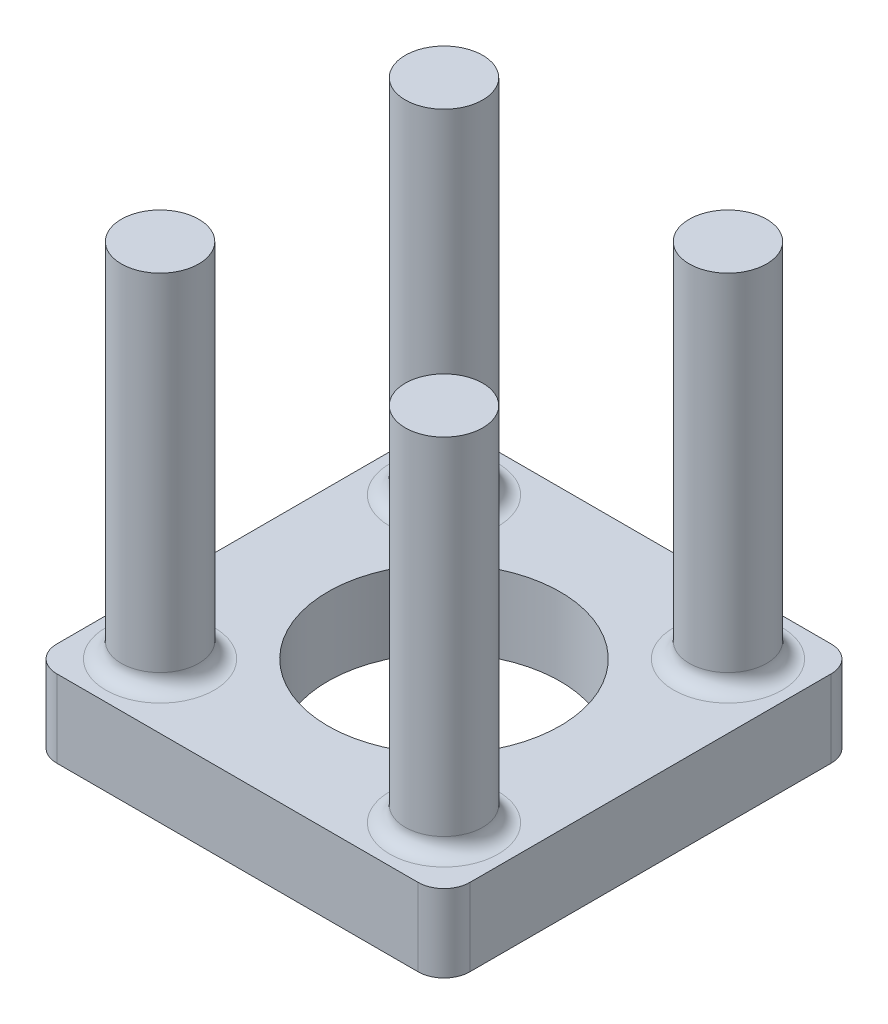
ISO-10303-21;
HEADER;
FILE_DESCRIPTION(('STEP AP214'),'2;1');
FILE_NAME('part.step','',(''),(''),'','','');
FILE_SCHEMA(('AUTOMOTIVE_DESIGN { 1 0 10303 214 1 1 1 1 }'));
ENDSEC;
DATA;
#1=APPLICATION_CONTEXT('core data for automotive mechanical design processes');
#2=APPLICATION_PROTOCOL_DEFINITION('international standard','automotive_design',2000,#1);
#3=PRODUCT_CONTEXT('',#1,'mechanical');
#4=PRODUCT('Part','Part','',(#3));
#5=PRODUCT_RELATED_PRODUCT_CATEGORY('part','',(#4));
#6=PRODUCT_DEFINITION_FORMATION('','',#4);
#7=PRODUCT_DEFINITION_CONTEXT('part definition',#1,'design');
#8=PRODUCT_DEFINITION('design','',#6,#7);
#9=PRODUCT_DEFINITION_SHAPE('','',#8);
#10=(LENGTH_UNIT() NAMED_UNIT(*) SI_UNIT(.MILLI.,.METRE.));
#11=(NAMED_UNIT(*) PLANE_ANGLE_UNIT() SI_UNIT($,.RADIAN.));
#12=(NAMED_UNIT(*) SI_UNIT($,.STERADIAN.) SOLID_ANGLE_UNIT());
#13=UNCERTAINTY_MEASURE_WITH_UNIT(LENGTH_MEASURE(1.E-05),#10,'distance_accuracy_value','');
#14=(GEOMETRIC_REPRESENTATION_CONTEXT(3) GLOBAL_UNCERTAINTY_ASSIGNED_CONTEXT((#13)) GLOBAL_UNIT_ASSIGNED_CONTEXT((#10,
#11,#12)) REPRESENTATION_CONTEXT('',''));
#15=CARTESIAN_POINT('',(0.,0.,0.));
#16=DIRECTION('',(0.,0.,1.));
#17=DIRECTION('',(1.,0.,0.));
#18=AXIS2_PLACEMENT_3D('',#15,#16,#17);
#19=CARTESIAN_POINT('',(0.,15.,0.));
#20=DIRECTION('',(0.,1.,0.));
#21=DIRECTION('',(0.,0.,1.));
#22=AXIS2_PLACEMENT_3D('',#19,#20,#21);
#23=PLANE('',#22);
#24=CARTESIAN_POINT('',(38.5243902439025,15.,48.9512195121952));
#25=DIRECTION('',(0.,1.,0.));
#26=DIRECTION('',(0.,0.,1.));
#27=AXIS2_PLACEMENT_3D('',#24,#25,#26);
#28=CIRCLE('',#27,10.5);
#29=CARTESIAN_POINT('',(38.5243902439025,15.,59.4512195121951));
#30=VERTEX_POINT('',#29);
#31=EDGE_CURVE('E211',#30,#30,#28,.F.);
#32=ORIENTED_EDGE('',*,*,#31,.T.);
#33=EDGE_LOOP('',(#32));
#34=FACE_BOUND('',#33,.T.);
#35=CARTESIAN_POINT('',(38.5243902439025,15.,-6.04878048780485));
#36=DIRECTION('',(0.,1.,0.));
#37=DIRECTION('',(0.,0.,1.));
#38=AXIS2_PLACEMENT_3D('',#35,#36,#37);
#39=CIRCLE('',#38,10.5);
#40=CARTESIAN_POINT('',(38.5243902439025,15.,4.45121951219515));
#41=VERTEX_POINT('',#40);
#42=EDGE_CURVE('E207',#41,#41,#39,.F.);
#43=ORIENTED_EDGE('',*,*,#42,.T.);
#44=EDGE_LOOP('',(#43));
#45=FACE_BOUND('',#44,.T.);
#46=CARTESIAN_POINT('',(-16.4756097560975,15.,-6.04878048780485));
#47=DIRECTION('',(0.,1.,0.));
#48=DIRECTION('',(0.,0.,1.));
#49=AXIS2_PLACEMENT_3D('',#46,#47,#48);
#50=CIRCLE('',#49,10.5);
#51=CARTESIAN_POINT('',(-16.4756097560975,15.,4.45121951219515));
#52=VERTEX_POINT('',#51);
#53=EDGE_CURVE('E203',#52,#52,#50,.F.);
#54=ORIENTED_EDGE('',*,*,#53,.T.);
#55=EDGE_LOOP('',(#54));
#56=FACE_BOUND('',#55,.T.);
#57=CARTESIAN_POINT('',(-16.4756097560975,15.,48.9512195121952));
#58=DIRECTION('',(0.,1.,0.));
#59=DIRECTION('',(0.,0.,1.));
#60=AXIS2_PLACEMENT_3D('',#57,#58,#59);
#61=CIRCLE('',#60,10.5);
#62=CARTESIAN_POINT('',(-16.4756097560975,15.,59.4512195121951));
#63=VERTEX_POINT('',#62);
#64=EDGE_CURVE('E199',#63,#63,#61,.F.);
#65=ORIENTED_EDGE('',*,*,#64,.T.);
#66=EDGE_LOOP('',(#65));
#67=FACE_BOUND('',#66,.T.);
#68=DIRECTION('',(-1.,0.,0.));
#69=VECTOR('',#68,1.);
#70=CARTESIAN_POINT('',(-28.9756097560975,15.,-18.5487804878048));
#71=LINE('',#70,#69);
#72=CARTESIAN_POINT('',(46.0243902439025,15.,-18.5487804878048));
#73=VERTEX_POINT('',#72);
#74=CARTESIAN_POINT('',(-23.9756097560975,15.,-18.5487804878048));
#75=VERTEX_POINT('',#74);
#76=EDGE_CURVE('E149',#73,#75,#71,.T.);
#77=ORIENTED_EDGE('',*,*,#76,.T.);
#78=CARTESIAN_POINT('',(-23.9756097560975,15.,-13.5487804878048));
#79=DIRECTION('',(0.,1.,0.));
#80=DIRECTION('',(0.,0.,1.));
#81=AXIS2_PLACEMENT_3D('',#78,#79,#80);
#82=CIRCLE('',#81,5.);
#83=CARTESIAN_POINT('',(-28.9756097560975,15.,-13.5487804878048));
#84=VERTEX_POINT('',#83);
#85=EDGE_CURVE('E179',#75,#84,#82,.T.);
#86=ORIENTED_EDGE('',*,*,#85,.T.);
#87=DIRECTION('',(0.,0.,1.));
#88=VECTOR('',#87,1.);
#89=CARTESIAN_POINT('',(-28.9756097560975,15.,-18.5487804878048));
#90=LINE('',#89,#88);
#91=CARTESIAN_POINT('',(-28.9756097560975,15.,56.4512195121951));
#92=VERTEX_POINT('',#91);
#93=EDGE_CURVE('E128',#84,#92,#90,.T.);
#94=ORIENTED_EDGE('',*,*,#93,.T.);
#95=CARTESIAN_POINT('',(-23.9756097560975,15.,56.4512195121952));
#96=DIRECTION('',(0.,1.,0.));
#97=DIRECTION('',(0.,0.,1.));
#98=AXIS2_PLACEMENT_3D('',#95,#96,#97);
#99=CIRCLE('',#98,5.);
#100=CARTESIAN_POINT('',(-23.9756097560975,15.,61.4512195121952));
#101=VERTEX_POINT('',#100);
#102=EDGE_CURVE('E176',#92,#101,#99,.T.);
#103=ORIENTED_EDGE('',*,*,#102,.T.);
#104=DIRECTION('',(1.,0.,0.));
#105=VECTOR('',#104,1.);
#106=CARTESIAN_POINT('',(-28.9756097560975,15.,61.4512195121952));
#107=LINE('',#106,#105);
#108=CARTESIAN_POINT('',(46.0243902439025,15.,61.4512195121952));
#109=VERTEX_POINT('',#108);
#110=EDGE_CURVE('E320',#101,#109,#107,.T.);
#111=ORIENTED_EDGE('',*,*,#110,.T.);
#112=CARTESIAN_POINT('',(46.0243902439025,15.,56.4512195121951));
#113=DIRECTION('',(0.,1.,0.));
#114=DIRECTION('',(0.,0.,1.));
#115=AXIS2_PLACEMENT_3D('',#112,#113,#114);
#116=CIRCLE('',#115,5.);
#117=CARTESIAN_POINT('',(51.0243902439025,15.,56.4512195121951));
#118=VERTEX_POINT('',#117);
#119=EDGE_CURVE('E62',#109,#118,#116,.T.);
#120=ORIENTED_EDGE('',*,*,#119,.T.);
#121=DIRECTION('',(0.,0.,-1.));
#122=VECTOR('',#121,1.);
#123=CARTESIAN_POINT('',(51.0243902439025,15.,-18.5487804878048));
#124=LINE('',#123,#122);
#125=CARTESIAN_POINT('',(51.0243902439025,15.,-13.5487804878048));
#126=VERTEX_POINT('',#125);
#127=EDGE_CURVE('E322',#118,#126,#124,.T.);
#128=ORIENTED_EDGE('',*,*,#127,.T.);
#129=CARTESIAN_POINT('',(46.0243902439025,15.,-13.5487804878048));
#130=DIRECTION('',(0.,1.,0.));
#131=DIRECTION('',(0.,0.,1.));
#132=AXIS2_PLACEMENT_3D('',#129,#130,#131);
#133=CIRCLE('',#132,5.);
#134=EDGE_CURVE('E171',#126,#73,#133,.T.);
#135=ORIENTED_EDGE('',*,*,#134,.T.);
#136=EDGE_LOOP('',(#77,#86,#94,#103,#111,#120,#128,#135));
#137=FACE_BOUND('',#136,.T.);
#138=CARTESIAN_POINT('',(11.0243902439025,15.,21.4512195121951));
#139=DIRECTION('',(0.,1.,0.));
#140=DIRECTION('',(0.,0.,1.));
#141=AXIS2_PLACEMENT_3D('',#138,#139,#140);
#142=CIRCLE('',#141,22.5);
#143=CARTESIAN_POINT('',(11.0243902439025,15.,43.9512195121951));
#144=VERTEX_POINT('',#143);
#145=EDGE_CURVE('E138',#144,#144,#142,.T.);
#146=ORIENTED_EDGE('',*,*,#145,.F.);
#147=EDGE_LOOP('',(#146));
#148=FACE_BOUND('',#147,.T.);
#149=ADVANCED_FACE('F39',(#34,#45,#56,#67,#137,#148),#23,.T.);
#150=CARTESIAN_POINT('',(0.,0.,0.));
#151=DIRECTION('',(0.,1.,0.));
#152=DIRECTION('',(0.,0.,1.));
#153=AXIS2_PLACEMENT_3D('',#150,#151,#152);
#154=PLANE('',#153);
#155=DIRECTION('',(0.,0.,1.));
#156=VECTOR('',#155,1.);
#157=CARTESIAN_POINT('',(-28.9756097560975,0.,-18.5487804878048));
#158=LINE('',#157,#156);
#159=CARTESIAN_POINT('',(-28.9756097560975,0.,-13.5487804878048));
#160=VERTEX_POINT('',#159);
#161=CARTESIAN_POINT('',(-28.9756097560975,0.,56.4512195121951));
#162=VERTEX_POINT('',#161);
#163=EDGE_CURVE('E125',#160,#162,#158,.T.);
#164=ORIENTED_EDGE('',*,*,#163,.F.);
#165=CARTESIAN_POINT('',(-23.9756097560975,0.,-13.5487804878048));
#166=DIRECTION('',(0.,1.,0.));
#167=DIRECTION('',(0.,0.,1.));
#168=AXIS2_PLACEMENT_3D('',#165,#166,#167);
#169=CIRCLE('',#168,5.);
#170=CARTESIAN_POINT('',(-23.9756097560975,0.,-18.5487804878048));
#171=VERTEX_POINT('',#170);
#172=EDGE_CURVE('E107',#160,#171,#169,.F.);
#173=ORIENTED_EDGE('',*,*,#172,.T.);
#174=DIRECTION('',(-1.,0.,0.));
#175=VECTOR('',#174,1.);
#176=CARTESIAN_POINT('',(-28.9756097560975,0.,-18.5487804878048));
#177=LINE('',#176,#175);
#178=CARTESIAN_POINT('',(46.0243902439025,0.,-18.5487804878048));
#179=VERTEX_POINT('',#178);
#180=EDGE_CURVE('E154',#179,#171,#177,.T.);
#181=ORIENTED_EDGE('',*,*,#180,.F.);
#182=CARTESIAN_POINT('',(46.0243902439025,0.,-13.5487804878048));
#183=DIRECTION('',(0.,1.,0.));
#184=DIRECTION('',(0.,0.,1.));
#185=AXIS2_PLACEMENT_3D('',#182,#183,#184);
#186=CIRCLE('',#185,5.);
#187=CARTESIAN_POINT('',(51.0243902439025,0.,-13.5487804878048));
#188=VERTEX_POINT('',#187);
#189=EDGE_CURVE('E130',#179,#188,#186,.F.);
#190=ORIENTED_EDGE('',*,*,#189,.T.);
#191=DIRECTION('',(0.,0.,-1.));
#192=VECTOR('',#191,1.);
#193=CARTESIAN_POINT('',(51.0243902439025,0.,-18.5487804878048));
#194=LINE('',#193,#192);
#195=CARTESIAN_POINT('',(51.0243902439025,0.,56.4512195121951));
#196=VERTEX_POINT('',#195);
#197=EDGE_CURVE('E143',#196,#188,#194,.T.);
#198=ORIENTED_EDGE('',*,*,#197,.F.);
#199=CARTESIAN_POINT('',(46.0243902439025,0.,56.4512195121951));
#200=DIRECTION('',(0.,1.,0.));
#201=DIRECTION('',(0.,0.,1.));
#202=AXIS2_PLACEMENT_3D('',#199,#200,#201);
#203=CIRCLE('',#202,5.);
#204=CARTESIAN_POINT('',(46.0243902439025,0.,61.4512195121952));
#205=VERTEX_POINT('',#204);
#206=EDGE_CURVE('E161',#196,#205,#203,.F.);
#207=ORIENTED_EDGE('',*,*,#206,.T.);
#208=DIRECTION('',(1.,0.,0.));
#209=VECTOR('',#208,1.);
#210=CARTESIAN_POINT('',(-28.9756097560975,0.,61.4512195121952));
#211=LINE('',#210,#209);
#212=CARTESIAN_POINT('',(-23.9756097560975,0.,61.4512195121952));
#213=VERTEX_POINT('',#212);
#214=EDGE_CURVE('E137',#213,#205,#211,.T.);
#215=ORIENTED_EDGE('',*,*,#214,.F.);
#216=CARTESIAN_POINT('',(-23.9756097560975,0.,56.4512195121952));
#217=DIRECTION('',(0.,1.,0.));
#218=DIRECTION('',(0.,0.,1.));
#219=AXIS2_PLACEMENT_3D('',#216,#217,#218);
#220=CIRCLE('',#219,5.);
#221=EDGE_CURVE('E119',#213,#162,#220,.F.);
#222=ORIENTED_EDGE('',*,*,#221,.T.);
#223=EDGE_LOOP('',(#164,#173,#181,#190,#198,#207,#215,#222));
#224=FACE_BOUND('',#223,.T.);
#225=CARTESIAN_POINT('',(11.0243902439025,0.,21.4512195121951));
#226=DIRECTION('',(0.,1.,0.));
#227=DIRECTION('',(0.,0.,1.));
#228=AXIS2_PLACEMENT_3D('',#225,#226,#227);
#229=CIRCLE('',#228,22.5);
#230=CARTESIAN_POINT('',(11.0243902439025,0.,43.9512195121951));
#231=VERTEX_POINT('',#230);
#232=EDGE_CURVE('E146',#231,#231,#229,.T.);
#233=ORIENTED_EDGE('',*,*,#232,.T.);
#234=EDGE_LOOP('',(#233));
#235=FACE_BOUND('',#234,.T.);
#236=ADVANCED_FACE('F133',(#224,#235),#154,.F.);
#237=CARTESIAN_POINT('',(-28.9756097560975,15.,-18.5487804878048));
#238=DIRECTION('',(1.,0.,0.));
#239=DIRECTION('',(0.,0.,-1.));
#240=AXIS2_PLACEMENT_3D('',#237,#238,#239);
#241=PLANE('',#240);
#242=ORIENTED_EDGE('',*,*,#93,.F.);
#243=DIRECTION('',(0.,-1.,0.));
#244=VECTOR('',#243,1.);
#245=CARTESIAN_POINT('',(-28.9756097560975,15.,-13.5487804878048));
#246=LINE('',#245,#244);
#247=EDGE_CURVE('E111',#84,#160,#246,.T.);
#248=ORIENTED_EDGE('',*,*,#247,.T.);
#249=ORIENTED_EDGE('',*,*,#163,.T.);
#250=DIRECTION('',(0.,-1.,0.));
#251=VECTOR('',#250,1.);
#252=CARTESIAN_POINT('',(-28.9756097560975,15.,56.4512195121951));
#253=LINE('',#252,#251);
#254=EDGE_CURVE('E131',#162,#92,#253,.F.);
#255=ORIENTED_EDGE('',*,*,#254,.T.);
#256=EDGE_LOOP('',(#242,#248,#249,#255));
#257=FACE_BOUND('',#256,.T.);
#258=ADVANCED_FACE('F124',(#257),#241,.F.);
#259=CARTESIAN_POINT('',(-28.9756097560975,15.,61.4512195121952));
#260=DIRECTION('',(0.,0.,-1.));
#261=DIRECTION('',(-1.,0.,0.));
#262=AXIS2_PLACEMENT_3D('',#259,#260,#261);
#263=PLANE('',#262);
#264=ORIENTED_EDGE('',*,*,#110,.F.);
#265=DIRECTION('',(0.,-1.,0.));
#266=VECTOR('',#265,1.);
#267=CARTESIAN_POINT('',(-23.9756097560975,15.,61.4512195121952));
#268=LINE('',#267,#266);
#269=EDGE_CURVE('E185',#101,#213,#268,.T.);
#270=ORIENTED_EDGE('',*,*,#269,.T.);
#271=ORIENTED_EDGE('',*,*,#214,.T.);
#272=DIRECTION('',(0.,-1.,0.));
#273=VECTOR('',#272,1.);
#274=CARTESIAN_POINT('',(46.0243902439025,15.,61.4512195121952));
#275=LINE('',#274,#273);
#276=EDGE_CURVE('E182',#205,#109,#275,.F.);
#277=ORIENTED_EDGE('',*,*,#276,.T.);
#278=EDGE_LOOP('',(#264,#270,#271,#277));
#279=FACE_BOUND('',#278,.T.);
#280=ADVANCED_FACE('F257',(#279),#263,.F.);
#281=CARTESIAN_POINT('',(51.0243902439025,15.,-18.5487804878048));
#282=DIRECTION('',(-1.,0.,0.));
#283=DIRECTION('',(0.,0.,1.));
#284=AXIS2_PLACEMENT_3D('',#281,#282,#283);
#285=PLANE('',#284);
#286=ORIENTED_EDGE('',*,*,#127,.F.);
#287=DIRECTION('',(0.,-1.,0.));
#288=VECTOR('',#287,1.);
#289=CARTESIAN_POINT('',(51.0243902439025,15.,56.4512195121951));
#290=LINE('',#289,#288);
#291=EDGE_CURVE('E191',#118,#196,#290,.T.);
#292=ORIENTED_EDGE('',*,*,#291,.T.);
#293=ORIENTED_EDGE('',*,*,#197,.T.);
#294=DIRECTION('',(0.,-1.,0.));
#295=VECTOR('',#294,1.);
#296=CARTESIAN_POINT('',(51.0243902439025,15.,-13.5487804878048));
#297=LINE('',#296,#295);
#298=EDGE_CURVE('E55',#188,#126,#297,.F.);
#299=ORIENTED_EDGE('',*,*,#298,.T.);
#300=EDGE_LOOP('',(#286,#292,#293,#299));
#301=FACE_BOUND('',#300,.T.);
#302=ADVANCED_FACE('F253',(#301),#285,.F.);
#303=CARTESIAN_POINT('',(-28.9756097560975,15.,-18.5487804878048));
#304=DIRECTION('',(0.,0.,1.));
#305=DIRECTION('',(1.,0.,0.));
#306=AXIS2_PLACEMENT_3D('',#303,#304,#305);
#307=PLANE('',#306);
#308=ORIENTED_EDGE('',*,*,#180,.T.);
#309=DIRECTION('',(0.,-1.,0.));
#310=VECTOR('',#309,1.);
#311=CARTESIAN_POINT('',(-23.9756097560975,15.,-18.5487804878048));
#312=LINE('',#311,#310);
#313=EDGE_CURVE('E112',#171,#75,#312,.F.);
#314=ORIENTED_EDGE('',*,*,#313,.T.);
#315=ORIENTED_EDGE('',*,*,#76,.F.);
#316=DIRECTION('',(0.,-1.,0.));
#317=VECTOR('',#316,1.);
#318=CARTESIAN_POINT('',(46.0243902439025,15.,-18.5487804878048));
#319=LINE('',#318,#317);
#320=EDGE_CURVE('E118',#73,#179,#319,.T.);
#321=ORIENTED_EDGE('',*,*,#320,.T.);
#322=EDGE_LOOP('',(#308,#314,#315,#321));
#323=FACE_BOUND('',#322,.T.);
#324=ADVANCED_FACE('F250',(#323),#307,.F.);
#325=CARTESIAN_POINT('',(11.0243902439025,15.,21.4512195121951));
#326=DIRECTION('',(0.,-1.,0.));
#327=DIRECTION('',(0.,0.,-1.));
#328=AXIS2_PLACEMENT_3D('',#325,#326,#327);
#329=CYLINDRICAL_SURFACE('',#328,22.5);
#330=ORIENTED_EDGE('',*,*,#145,.T.);
#331=EDGE_LOOP('',(#330));
#332=FACE_BOUND('',#331,.T.);
#333=ORIENTED_EDGE('',*,*,#232,.F.);
#334=EDGE_LOOP('',(#333));
#335=FACE_BOUND('',#334,.T.);
#336=ADVANCED_FACE('F247',(#332,#335),#329,.F.);
#337=CARTESIAN_POINT('',(-23.9756097560975,15.,-13.5487804878048));
#338=DIRECTION('',(0.,-1.,0.));
#339=DIRECTION('',(0.,0.,-1.));
#340=AXIS2_PLACEMENT_3D('',#337,#338,#339);
#341=CYLINDRICAL_SURFACE('',#340,5.);
#342=ORIENTED_EDGE('',*,*,#85,.F.);
#343=ORIENTED_EDGE('',*,*,#313,.F.);
#344=ORIENTED_EDGE('',*,*,#172,.F.);
#345=ORIENTED_EDGE('',*,*,#247,.F.);
#346=EDGE_LOOP('',(#342,#343,#344,#345));
#347=FACE_BOUND('',#346,.T.);
#348=ADVANCED_FACE('F110',(#347),#341,.T.);
#349=CARTESIAN_POINT('',(-23.9756097560975,15.,56.4512195121952));
#350=DIRECTION('',(0.,-1.,0.));
#351=DIRECTION('',(0.,0.,-1.));
#352=AXIS2_PLACEMENT_3D('',#349,#350,#351);
#353=CYLINDRICAL_SURFACE('',#352,5.);
#354=ORIENTED_EDGE('',*,*,#102,.F.);
#355=ORIENTED_EDGE('',*,*,#254,.F.);
#356=ORIENTED_EDGE('',*,*,#221,.F.);
#357=ORIENTED_EDGE('',*,*,#269,.F.);
#358=EDGE_LOOP('',(#354,#355,#356,#357));
#359=FACE_BOUND('',#358,.T.);
#360=ADVANCED_FACE('F265',(#359),#353,.T.);
#361=CARTESIAN_POINT('',(46.0243902439025,15.,56.4512195121951));
#362=DIRECTION('',(0.,-1.,0.));
#363=DIRECTION('',(0.,0.,-1.));
#364=AXIS2_PLACEMENT_3D('',#361,#362,#363);
#365=CYLINDRICAL_SURFACE('',#364,5.);
#366=ORIENTED_EDGE('',*,*,#119,.F.);
#367=ORIENTED_EDGE('',*,*,#276,.F.);
#368=ORIENTED_EDGE('',*,*,#206,.F.);
#369=ORIENTED_EDGE('',*,*,#291,.F.);
#370=EDGE_LOOP('',(#366,#367,#368,#369));
#371=FACE_BOUND('',#370,.T.);
#372=ADVANCED_FACE('F268',(#371),#365,.T.);
#373=CARTESIAN_POINT('',(46.0243902439025,15.,-13.5487804878048));
#374=DIRECTION('',(0.,-1.,0.));
#375=DIRECTION('',(0.,0.,-1.));
#376=AXIS2_PLACEMENT_3D('',#373,#374,#375);
#377=CYLINDRICAL_SURFACE('',#376,5.);
#378=ORIENTED_EDGE('',*,*,#134,.F.);
#379=ORIENTED_EDGE('',*,*,#298,.F.);
#380=ORIENTED_EDGE('',*,*,#189,.F.);
#381=ORIENTED_EDGE('',*,*,#320,.F.);
#382=EDGE_LOOP('',(#378,#379,#380,#381));
#383=FACE_BOUND('',#382,.T.);
#384=ADVANCED_FACE('F272',(#383),#377,.T.);
#385=CARTESIAN_POINT('',(-16.4756097560975,85.,-6.04878048780485));
#386=DIRECTION('',(0.,-1.,0.));
#387=DIRECTION('',(0.,0.,-1.));
#388=AXIS2_PLACEMENT_3D('',#385,#386,#387);
#389=CYLINDRICAL_SURFACE('',#388,7.5);
#390=CARTESIAN_POINT('',(-16.4756097560975,18.,-6.04878048780485));
#391=DIRECTION('',(0.,1.,0.));
#392=DIRECTION('',(0.,0.,1.));
#393=AXIS2_PLACEMENT_3D('',#390,#391,#392);
#394=CIRCLE('',#393,7.5);
#395=CARTESIAN_POINT('',(-16.4756097560975,18.,1.45121951219515));
#396=VERTEX_POINT('',#395);
#397=EDGE_CURVE('E48',#396,#396,#394,.T.);
#398=ORIENTED_EDGE('',*,*,#397,.T.);
#399=EDGE_LOOP('',(#398));
#400=FACE_BOUND('',#399,.T.);
#401=CARTESIAN_POINT('',(-16.4756097560975,85.,-6.04878048780485));
#402=DIRECTION('',(0.,1.,0.));
#403=DIRECTION('',(0.,0.,1.));
#404=AXIS2_PLACEMENT_3D('',#401,#402,#403);
#405=CIRCLE('',#404,7.5);
#406=CARTESIAN_POINT('',(-16.4756097560975,85.,1.45121951219515));
#407=VERTEX_POINT('',#406);
#408=EDGE_CURVE('E307',#407,#407,#405,.T.);
#409=ORIENTED_EDGE('',*,*,#408,.F.);
#410=EDGE_LOOP('',(#409));
#411=FACE_BOUND('',#410,.T.);
#412=ADVANCED_FACE('F222',(#400,#411),#389,.T.);
#413=CARTESIAN_POINT('',(-16.4756097560975,85.,-6.04878048780485));
#414=DIRECTION('',(0.,1.,0.));
#415=DIRECTION('',(0.,0.,1.));
#416=AXIS2_PLACEMENT_3D('',#413,#414,#415);
#417=PLANE('',#416);
#418=ORIENTED_EDGE('',*,*,#408,.T.);
#419=EDGE_LOOP('',(#418));
#420=FACE_BOUND('',#419,.T.);
#421=ADVANCED_FACE('F369',(#420),#417,.T.);
#422=CARTESIAN_POINT('',(38.5243902439025,85.,-6.04878048780485));
#423=DIRECTION('',(0.,-1.,0.));
#424=DIRECTION('',(0.,0.,-1.));
#425=AXIS2_PLACEMENT_3D('',#422,#423,#424);
#426=CYLINDRICAL_SURFACE('',#425,7.5);
#427=CARTESIAN_POINT('',(38.5243902439025,18.,-6.04878048780485));
#428=DIRECTION('',(0.,1.,0.));
#429=DIRECTION('',(0.,0.,1.));
#430=AXIS2_PLACEMENT_3D('',#427,#428,#429);
#431=CIRCLE('',#430,7.5);
#432=CARTESIAN_POINT('',(38.5243902439025,18.,1.45121951219515));
#433=VERTEX_POINT('',#432);
#434=EDGE_CURVE('E215',#433,#433,#431,.T.);
#435=ORIENTED_EDGE('',*,*,#434,.T.);
#436=EDGE_LOOP('',(#435));
#437=FACE_BOUND('',#436,.T.);
#438=CARTESIAN_POINT('',(38.5243902439025,85.,-6.04878048780485));
#439=DIRECTION('',(0.,1.,0.));
#440=DIRECTION('',(0.,0.,1.));
#441=AXIS2_PLACEMENT_3D('',#438,#439,#440);
#442=CIRCLE('',#441,7.5);
#443=CARTESIAN_POINT('',(38.5243902439025,85.,1.45121951219515));
#444=VERTEX_POINT('',#443);
#445=EDGE_CURVE('E301',#444,#444,#442,.T.);
#446=ORIENTED_EDGE('',*,*,#445,.F.);
#447=EDGE_LOOP('',(#446));
#448=FACE_BOUND('',#447,.T.);
#449=ADVANCED_FACE('F375',(#437,#448),#426,.T.);
#450=CARTESIAN_POINT('',(38.5243902439025,85.,-6.04878048780485));
#451=DIRECTION('',(0.,1.,0.));
#452=DIRECTION('',(0.,0.,1.));
#453=AXIS2_PLACEMENT_3D('',#450,#451,#452);
#454=PLANE('',#453);
#455=ORIENTED_EDGE('',*,*,#445,.T.);
#456=EDGE_LOOP('',(#455));
#457=FACE_BOUND('',#456,.T.);
#458=ADVANCED_FACE('F294',(#457),#454,.T.);
#459=CARTESIAN_POINT('',(38.5243902439025,85.,48.9512195121952));
#460=DIRECTION('',(0.,-1.,0.));
#461=DIRECTION('',(0.,0.,-1.));
#462=AXIS2_PLACEMENT_3D('',#459,#460,#461);
#463=CYLINDRICAL_SURFACE('',#462,7.5);
#464=CARTESIAN_POINT('',(38.5243902439025,18.,48.9512195121952));
#465=DIRECTION('',(0.,1.,0.));
#466=DIRECTION('',(0.,0.,1.));
#467=AXIS2_PLACEMENT_3D('',#464,#465,#466);
#468=CIRCLE('',#467,7.5);
#469=CARTESIAN_POINT('',(38.5243902439025,18.,56.4512195121952));
#470=VERTEX_POINT('',#469);
#471=EDGE_CURVE('E195',#470,#470,#468,.T.);
#472=ORIENTED_EDGE('',*,*,#471,.T.);
#473=EDGE_LOOP('',(#472));
#474=FACE_BOUND('',#473,.T.);
#475=CARTESIAN_POINT('',(38.5243902439025,85.,48.9512195121952));
#476=DIRECTION('',(0.,1.,0.));
#477=DIRECTION('',(0.,0.,1.));
#478=AXIS2_PLACEMENT_3D('',#475,#476,#477);
#479=CIRCLE('',#478,7.5);
#480=CARTESIAN_POINT('',(38.5243902439025,85.,56.4512195121952));
#481=VERTEX_POINT('',#480);
#482=EDGE_CURVE('E298',#481,#481,#479,.T.);
#483=ORIENTED_EDGE('',*,*,#482,.F.);
#484=EDGE_LOOP('',(#483));
#485=FACE_BOUND('',#484,.T.);
#486=ADVANCED_FACE('F290',(#474,#485),#463,.T.);
#487=CARTESIAN_POINT('',(38.5243902439025,85.,48.9512195121952));
#488=DIRECTION('',(0.,1.,0.));
#489=DIRECTION('',(0.,0.,1.));
#490=AXIS2_PLACEMENT_3D('',#487,#488,#489);
#491=PLANE('',#490);
#492=ORIENTED_EDGE('',*,*,#482,.T.);
#493=EDGE_LOOP('',(#492));
#494=FACE_BOUND('',#493,.T.);
#495=ADVANCED_FACE('F293',(#494),#491,.T.);
#496=CARTESIAN_POINT('',(-16.4756097560975,85.,48.9512195121952));
#497=DIRECTION('',(0.,-1.,0.));
#498=DIRECTION('',(0.,0.,-1.));
#499=AXIS2_PLACEMENT_3D('',#496,#497,#498);
#500=CYLINDRICAL_SURFACE('',#499,7.5);
#501=CARTESIAN_POINT('',(-16.4756097560975,18.,48.9512195121952));
#502=DIRECTION('',(0.,1.,0.));
#503=DIRECTION('',(0.,0.,1.));
#504=AXIS2_PLACEMENT_3D('',#501,#502,#503);
#505=CIRCLE('',#504,7.5);
#506=CARTESIAN_POINT('',(-16.4756097560975,18.,56.4512195121952));
#507=VERTEX_POINT('',#506);
#508=EDGE_CURVE('E11',#507,#507,#505,.T.);
#509=ORIENTED_EDGE('',*,*,#508,.T.);
#510=EDGE_LOOP('',(#509));
#511=FACE_BOUND('',#510,.T.);
#512=CARTESIAN_POINT('',(-16.4756097560975,85.,48.9512195121952));
#513=DIRECTION('',(0.,1.,0.));
#514=DIRECTION('',(0.,0.,1.));
#515=AXIS2_PLACEMENT_3D('',#512,#513,#514);
#516=CIRCLE('',#515,7.5);
#517=CARTESIAN_POINT('',(-16.4756097560975,85.,56.4512195121952));
#518=VERTEX_POINT('',#517);
#519=EDGE_CURVE('E302',#518,#518,#516,.T.);
#520=ORIENTED_EDGE('',*,*,#519,.F.);
#521=EDGE_LOOP('',(#520));
#522=FACE_BOUND('',#521,.T.);
#523=ADVANCED_FACE('F283',(#511,#522),#500,.T.);
#524=CARTESIAN_POINT('',(-16.4756097560975,85.,48.9512195121952));
#525=DIRECTION('',(0.,1.,0.));
#526=DIRECTION('',(0.,0.,1.));
#527=AXIS2_PLACEMENT_3D('',#524,#525,#526);
#528=PLANE('',#527);
#529=ORIENTED_EDGE('',*,*,#519,.T.);
#530=EDGE_LOOP('',(#529));
#531=FACE_BOUND('',#530,.T.);
#532=ADVANCED_FACE('F278',(#531),#528,.T.);
#533=CARTESIAN_POINT('',(38.5243902439025,18.,48.9512195121952));
#534=DIRECTION('',(0.,1.,0.));
#535=DIRECTION('',(0.,0.,1.));
#536=AXIS2_PLACEMENT_3D('',#533,#534,#535);
#537=TOROIDAL_SURFACE('',#536,10.5,3.);
#538=ORIENTED_EDGE('',*,*,#31,.F.);
#539=EDGE_LOOP('',(#538));
#540=FACE_BOUND('',#539,.T.);
#541=ORIENTED_EDGE('',*,*,#471,.F.);
#542=EDGE_LOOP('',(#541));
#543=FACE_BOUND('',#542,.T.);
#544=ADVANCED_FACE('F234',(#540,#543),#537,.F.);
#545=CARTESIAN_POINT('',(38.5243902439025,18.,-6.04878048780485));
#546=DIRECTION('',(0.,1.,0.));
#547=DIRECTION('',(0.,0.,1.));
#548=AXIS2_PLACEMENT_3D('',#545,#546,#547);
#549=TOROIDAL_SURFACE('',#548,10.5,3.);
#550=ORIENTED_EDGE('',*,*,#42,.F.);
#551=EDGE_LOOP('',(#550));
#552=FACE_BOUND('',#551,.T.);
#553=ORIENTED_EDGE('',*,*,#434,.F.);
#554=EDGE_LOOP('',(#553));
#555=FACE_BOUND('',#554,.T.);
#556=ADVANCED_FACE('F227',(#552,#555),#549,.F.);
#557=CARTESIAN_POINT('',(-16.4756097560975,18.,-6.04878048780485));
#558=DIRECTION('',(0.,1.,0.));
#559=DIRECTION('',(0.,0.,1.));
#560=AXIS2_PLACEMENT_3D('',#557,#558,#559);
#561=TOROIDAL_SURFACE('',#560,10.5,3.);
#562=ORIENTED_EDGE('',*,*,#53,.F.);
#563=EDGE_LOOP('',(#562));
#564=FACE_BOUND('',#563,.T.);
#565=ORIENTED_EDGE('',*,*,#397,.F.);
#566=EDGE_LOOP('',(#565));
#567=FACE_BOUND('',#566,.T.);
#568=ADVANCED_FACE('F225',(#564,#567),#561,.F.);
#569=CARTESIAN_POINT('',(-16.4756097560975,18.,48.9512195121952));
#570=DIRECTION('',(0.,1.,0.));
#571=DIRECTION('',(0.,0.,1.));
#572=AXIS2_PLACEMENT_3D('',#569,#570,#571);
#573=TOROIDAL_SURFACE('',#572,10.5,3.);
#574=ORIENTED_EDGE('',*,*,#64,.F.);
#575=EDGE_LOOP('',(#574));
#576=FACE_BOUND('',#575,.T.);
#577=ORIENTED_EDGE('',*,*,#508,.F.);
#578=EDGE_LOOP('',(#577));
#579=FACE_BOUND('',#578,.T.);
#580=ADVANCED_FACE('F41',(#576,#579),#573,.F.);
#581=CLOSED_SHELL('',(#149,#236,#258,#280,#302,#324,#336,#348,#360,#372,#384,#412,#421,#449,
#458,#486,#495,#523,#532,#544,#556,#568,#580));
#582=MANIFOLD_SOLID_BREP('B2',#581);
#583=ADVANCED_BREP_SHAPE_REPRESENTATION('',(#18,#582),#14);
#584=SHAPE_DEFINITION_REPRESENTATION(#9,#583);
ENDSEC;
END-ISO-10303-21;
